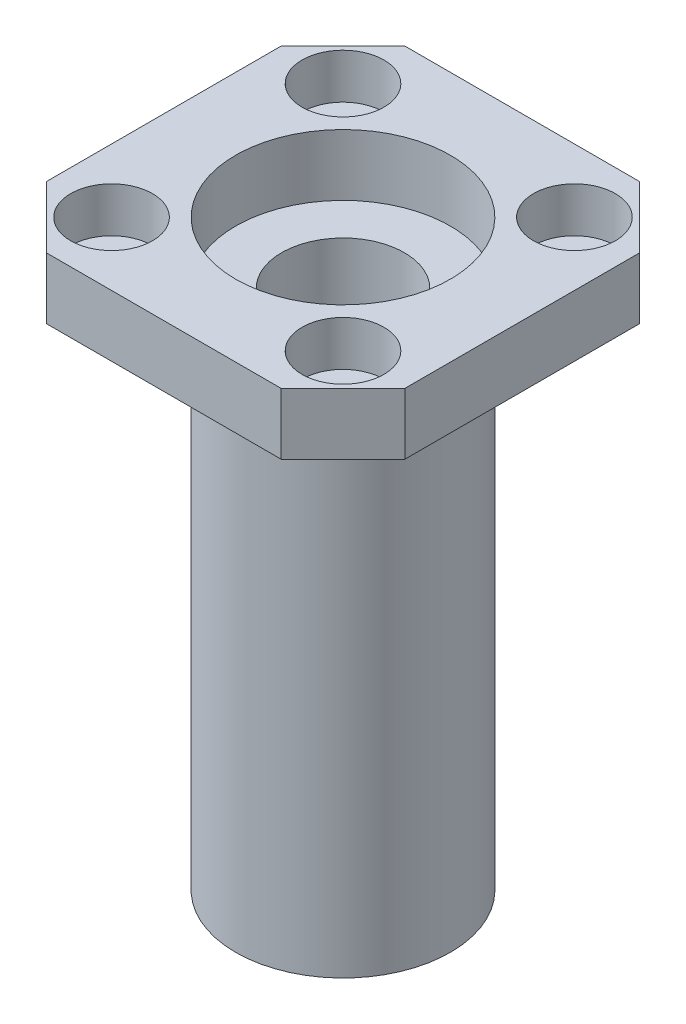
ISO-10303-21;
HEADER;
FILE_DESCRIPTION(('STEP AP214'),'2;1');
FILE_NAME('part.step','',(''),(''),'','','');
FILE_SCHEMA(('AUTOMOTIVE_DESIGN { 1 0 10303 214 1 1 1 1 }'));
ENDSEC;
DATA;
#1=APPLICATION_CONTEXT('core data for automotive mechanical design processes');
#2=APPLICATION_PROTOCOL_DEFINITION('international standard','automotive_design',2000,#1);
#3=PRODUCT_CONTEXT('',#1,'mechanical');
#4=PRODUCT('Part','Part','',(#3));
#5=PRODUCT_RELATED_PRODUCT_CATEGORY('part','',(#4));
#6=PRODUCT_DEFINITION_FORMATION('','',#4);
#7=PRODUCT_DEFINITION_CONTEXT('part definition',#1,'design');
#8=PRODUCT_DEFINITION('design','',#6,#7);
#9=PRODUCT_DEFINITION_SHAPE('','',#8);
#10=(LENGTH_UNIT() NAMED_UNIT(*) SI_UNIT(.MILLI.,.METRE.));
#11=(NAMED_UNIT(*) PLANE_ANGLE_UNIT() SI_UNIT($,.RADIAN.));
#12=(NAMED_UNIT(*) SI_UNIT($,.STERADIAN.) SOLID_ANGLE_UNIT());
#13=UNCERTAINTY_MEASURE_WITH_UNIT(LENGTH_MEASURE(1.E-05),#10,'distance_accuracy_value','');
#14=(GEOMETRIC_REPRESENTATION_CONTEXT(3) GLOBAL_UNCERTAINTY_ASSIGNED_CONTEXT((#13)) GLOBAL_UNIT_ASSIGNED_CONTEXT((#10,
#11,#12)) REPRESENTATION_CONTEXT('',''));
#15=CARTESIAN_POINT('',(0.,0.,0.));
#16=DIRECTION('',(0.,0.,1.));
#17=DIRECTION('',(1.,0.,0.));
#18=AXIS2_PLACEMENT_3D('',#15,#16,#17);
#19=CARTESIAN_POINT('',(-11.3137084989848,57.,11.3137084989848));
#20=DIRECTION('',(0.,-1.,0.));
#21=DIRECTION('',(0.,0.,-1.));
#22=AXIS2_PLACEMENT_3D('',#19,#20,#21);
#23=CYLINDRICAL_SURFACE('',#22,2.25);
#24=CARTESIAN_POINT('',(-11.3137084989848,51.,11.3137084989848));
#25=DIRECTION('',(0.,1.,0.));
#26=DIRECTION('',(0.,0.,1.));
#27=AXIS2_PLACEMENT_3D('',#24,#25,#26);
#28=CIRCLE('',#27,2.25);
#29=CARTESIAN_POINT('',(-11.3137084989848,51.,13.5637084989848));
#30=VERTEX_POINT('',#29);
#31=EDGE_CURVE('E154',#30,#30,#28,.T.);
#32=ORIENTED_EDGE('',*,*,#31,.F.);
#33=EDGE_LOOP('',(#32));
#34=FACE_BOUND('',#33,.T.);
#35=CARTESIAN_POINT('',(-11.3137084989848,52.6,11.3137084989848));
#36=DIRECTION('',(0.,1.,0.));
#37=DIRECTION('',(0.,0.,1.));
#38=AXIS2_PLACEMENT_3D('',#35,#36,#37);
#39=CIRCLE('',#38,2.25);
#40=CARTESIAN_POINT('',(-11.3137084989848,52.6,13.5637084989848));
#41=VERTEX_POINT('',#40);
#42=EDGE_CURVE('E46',#41,#41,#39,.T.);
#43=ORIENTED_EDGE('',*,*,#42,.T.);
#44=EDGE_LOOP('',(#43));
#45=FACE_BOUND('',#44,.T.);
#46=ADVANCED_FACE('F42',(#34,#45),#23,.F.);
#47=CARTESIAN_POINT('',(11.3137084989848,57.,11.3137084989848));
#48=DIRECTION('',(0.,-1.,0.));
#49=DIRECTION('',(0.,0.,-1.));
#50=AXIS2_PLACEMENT_3D('',#47,#48,#49);
#51=CYLINDRICAL_SURFACE('',#50,2.25);
#52=CARTESIAN_POINT('',(11.3137084989848,51.,11.3137084989848));
#53=DIRECTION('',(0.,1.,0.));
#54=DIRECTION('',(0.,0.,1.));
#55=AXIS2_PLACEMENT_3D('',#52,#53,#54);
#56=CIRCLE('',#55,2.25);
#57=CARTESIAN_POINT('',(11.3137084989848,51.,13.5637084989848));
#58=VERTEX_POINT('',#57);
#59=EDGE_CURVE('E150',#58,#58,#56,.T.);
#60=ORIENTED_EDGE('',*,*,#59,.F.);
#61=EDGE_LOOP('',(#60));
#62=FACE_BOUND('',#61,.T.);
#63=CARTESIAN_POINT('',(11.3137084989848,52.6,11.3137084989848));
#64=DIRECTION('',(0.,1.,0.));
#65=DIRECTION('',(0.,0.,1.));
#66=AXIS2_PLACEMENT_3D('',#63,#64,#65);
#67=CIRCLE('',#66,2.25);
#68=CARTESIAN_POINT('',(11.3137084989848,52.6,13.5637084989848));
#69=VERTEX_POINT('',#68);
#70=EDGE_CURVE('E195',#69,#69,#67,.T.);
#71=ORIENTED_EDGE('',*,*,#70,.T.);
#72=EDGE_LOOP('',(#71));
#73=FACE_BOUND('',#72,.T.);
#74=ADVANCED_FACE('F245',(#62,#73),#51,.F.);
#75=CARTESIAN_POINT('',(11.3137084989848,57.,-11.3137084989848));
#76=DIRECTION('',(0.,-1.,0.));
#77=DIRECTION('',(0.,0.,-1.));
#78=AXIS2_PLACEMENT_3D('',#75,#76,#77);
#79=CYLINDRICAL_SURFACE('',#78,2.25);
#80=CARTESIAN_POINT('',(11.3137084989848,51.,-11.3137084989848));
#81=DIRECTION('',(0.,1.,0.));
#82=DIRECTION('',(0.,0.,1.));
#83=AXIS2_PLACEMENT_3D('',#80,#81,#82);
#84=CIRCLE('',#83,2.25);
#85=CARTESIAN_POINT('',(11.3137084989848,51.,-9.06370849898476));
#86=VERTEX_POINT('',#85);
#87=EDGE_CURVE('E147',#86,#86,#84,.T.);
#88=ORIENTED_EDGE('',*,*,#87,.F.);
#89=EDGE_LOOP('',(#88));
#90=FACE_BOUND('',#89,.T.);
#91=CARTESIAN_POINT('',(11.3137084989848,52.6,-11.3137084989848));
#92=DIRECTION('',(0.,1.,0.));
#93=DIRECTION('',(0.,0.,1.));
#94=AXIS2_PLACEMENT_3D('',#91,#92,#93);
#95=CIRCLE('',#94,2.25);
#96=CARTESIAN_POINT('',(11.3137084989848,52.6,-9.06370849898476));
#97=VERTEX_POINT('',#96);
#98=EDGE_CURVE('E193',#97,#97,#95,.T.);
#99=ORIENTED_EDGE('',*,*,#98,.T.);
#100=EDGE_LOOP('',(#99));
#101=FACE_BOUND('',#100,.T.);
#102=ADVANCED_FACE('F44',(#90,#101),#79,.F.);
#103=CARTESIAN_POINT('',(-11.3137084989848,57.,-11.3137084989848));
#104=DIRECTION('',(0.,-1.,0.));
#105=DIRECTION('',(0.,0.,-1.));
#106=AXIS2_PLACEMENT_3D('',#103,#104,#105);
#107=CYLINDRICAL_SURFACE('',#106,2.25);
#108=CARTESIAN_POINT('',(-11.3137084989848,51.,-11.3137084989848));
#109=DIRECTION('',(0.,1.,0.));
#110=DIRECTION('',(0.,0.,1.));
#111=AXIS2_PLACEMENT_3D('',#108,#109,#110);
#112=CIRCLE('',#111,2.25);
#113=CARTESIAN_POINT('',(-11.3137084989848,51.,-9.06370849898476));
#114=VERTEX_POINT('',#113);
#115=EDGE_CURVE('E157',#114,#114,#112,.T.);
#116=ORIENTED_EDGE('',*,*,#115,.F.);
#117=EDGE_LOOP('',(#116));
#118=FACE_BOUND('',#117,.T.);
#119=CARTESIAN_POINT('',(-11.3137084989848,52.6,-11.3137084989848));
#120=DIRECTION('',(0.,1.,0.));
#121=DIRECTION('',(0.,0.,1.));
#122=AXIS2_PLACEMENT_3D('',#119,#120,#121);
#123=CIRCLE('',#122,2.25);
#124=CARTESIAN_POINT('',(-11.3137084989848,52.6,-9.06370849898476));
#125=VERTEX_POINT('',#124);
#126=EDGE_CURVE('E151',#125,#125,#123,.T.);
#127=ORIENTED_EDGE('',*,*,#126,.T.);
#128=EDGE_LOOP('',(#127));
#129=FACE_BOUND('',#128,.T.);
#130=ADVANCED_FACE('F254',(#118,#129),#107,.F.);
#131=CARTESIAN_POINT('',(0.,57.,17.5165451856643));
#132=DIRECTION('',(0.,0.,-1.));
#133=DIRECTION('',(-1.,0.,0.));
#134=AXIS2_PLACEMENT_3D('',#131,#132,#133);
#135=PLANE('',#134);
#136=DIRECTION('',(1.,0.,0.));
#137=VECTOR('',#136,1.);
#138=CARTESIAN_POINT('',(0.,51.,17.5165451856643));
#139=LINE('',#138,#137);
#140=CARTESIAN_POINT('',(-11.4748328429842,51.,17.5165451856643));
#141=VERTEX_POINT('',#140);
#142=CARTESIAN_POINT('',(11.4748328429842,51.,17.5165451856643));
#143=VERTEX_POINT('',#142);
#144=EDGE_CURVE('E160',#141,#143,#139,.T.);
#145=ORIENTED_EDGE('',*,*,#144,.T.);
#146=DIRECTION('',(0.,-1.,0.));
#147=VECTOR('',#146,1.);
#148=CARTESIAN_POINT('',(11.4748328429842,57.,17.5165451856643));
#149=LINE('',#148,#147);
#150=CARTESIAN_POINT('',(11.4748328429842,57.,17.5165451856643));
#151=VERTEX_POINT('',#150);
#152=EDGE_CURVE('E12',#151,#143,#149,.T.);
#153=ORIENTED_EDGE('',*,*,#152,.F.);
#154=DIRECTION('',(1.,0.,0.));
#155=VECTOR('',#154,1.);
#156=CARTESIAN_POINT('',(0.,57.,17.5165451856643));
#157=LINE('',#156,#155);
#158=CARTESIAN_POINT('',(-11.4748328429842,57.,17.5165451856643));
#159=VERTEX_POINT('',#158);
#160=EDGE_CURVE('E181',#159,#151,#157,.T.);
#161=ORIENTED_EDGE('',*,*,#160,.F.);
#162=DIRECTION('',(0.,-1.,0.));
#163=VECTOR('',#162,1.);
#164=CARTESIAN_POINT('',(-11.4748328429842,57.,17.5165451856643));
#165=LINE('',#164,#163);
#166=EDGE_CURVE('E146',#159,#141,#165,.T.);
#167=ORIENTED_EDGE('',*,*,#166,.T.);
#168=EDGE_LOOP('',(#145,#153,#161,#167));
#169=FACE_BOUND('',#168,.T.);
#170=ADVANCED_FACE('F231',(#169),#135,.F.);
#171=CARTESIAN_POINT('',(14.4956890143242,57.,14.4956890143242));
#172=DIRECTION('',(-0.707106781186547,0.,-0.707106781186547));
#173=DIRECTION('',(-0.707106781186548,0.,0.707106781186548));
#174=AXIS2_PLACEMENT_3D('',#171,#172,#173);
#175=PLANE('',#174);
#176=DIRECTION('',(0.707106781186548,0.,-0.707106781186548));
#177=VECTOR('',#176,1.);
#178=CARTESIAN_POINT('',(14.4956890143242,51.,14.4956890143242));
#179=LINE('',#178,#177);
#180=CARTESIAN_POINT('',(17.5165451856643,51.,11.4748328429842));
#181=VERTEX_POINT('',#180);
#182=EDGE_CURVE('E163',#143,#181,#179,.T.);
#183=ORIENTED_EDGE('',*,*,#182,.T.);
#184=DIRECTION('',(0.,-1.,0.));
#185=VECTOR('',#184,1.);
#186=CARTESIAN_POINT('',(17.5165451856643,57.,11.4748328429842));
#187=LINE('',#186,#185);
#188=CARTESIAN_POINT('',(17.5165451856643,57.,11.4748328429842));
#189=VERTEX_POINT('',#188);
#190=EDGE_CURVE('E52',#189,#181,#187,.T.);
#191=ORIENTED_EDGE('',*,*,#190,.F.);
#192=DIRECTION('',(0.707106781186548,0.,-0.707106781186548));
#193=VECTOR('',#192,1.);
#194=CARTESIAN_POINT('',(14.4956890143242,57.,14.4956890143242));
#195=LINE('',#194,#193);
#196=EDGE_CURVE('E103',#151,#189,#195,.T.);
#197=ORIENTED_EDGE('',*,*,#196,.F.);
#198=ORIENTED_EDGE('',*,*,#152,.T.);
#199=EDGE_LOOP('',(#183,#191,#197,#198));
#200=FACE_BOUND('',#199,.T.);
#201=ADVANCED_FACE('F260',(#200),#175,.F.);
#202=CARTESIAN_POINT('',(17.5165451856643,57.,0.));
#203=DIRECTION('',(1.,0.,0.));
#204=DIRECTION('',(0.,0.,-1.));
#205=AXIS2_PLACEMENT_3D('',#202,#203,#204);
#206=PLANE('',#205);
#207=DIRECTION('',(0.,0.,1.));
#208=VECTOR('',#207,1.);
#209=CARTESIAN_POINT('',(17.5165451856643,51.,0.));
#210=LINE('',#209,#208);
#211=CARTESIAN_POINT('',(17.5165451856643,51.,-11.4748328429842));
#212=VERTEX_POINT('',#211);
#213=EDGE_CURVE('E166',#212,#181,#210,.T.);
#214=ORIENTED_EDGE('',*,*,#213,.F.);
#215=DIRECTION('',(0.,-1.,0.));
#216=VECTOR('',#215,1.);
#217=CARTESIAN_POINT('',(17.5165451856643,57.,-11.4748328429842));
#218=LINE('',#217,#216);
#219=CARTESIAN_POINT('',(17.5165451856643,57.,-11.4748328429842));
#220=VERTEX_POINT('',#219);
#221=EDGE_CURVE('E187',#220,#212,#218,.T.);
#222=ORIENTED_EDGE('',*,*,#221,.F.);
#223=DIRECTION('',(0.,0.,1.));
#224=VECTOR('',#223,1.);
#225=CARTESIAN_POINT('',(17.5165451856643,57.,0.));
#226=LINE('',#225,#224);
#227=EDGE_CURVE('E214',#220,#189,#226,.T.);
#228=ORIENTED_EDGE('',*,*,#227,.T.);
#229=ORIENTED_EDGE('',*,*,#190,.T.);
#230=EDGE_LOOP('',(#214,#222,#228,#229));
#231=FACE_BOUND('',#230,.T.);
#232=ADVANCED_FACE('F263',(#231),#206,.T.);
#233=CARTESIAN_POINT('',(14.4956890143242,57.,-14.4956890143242));
#234=DIRECTION('',(0.707106781186548,0.,-0.707106781186547));
#235=DIRECTION('',(-0.707106781186547,0.,-0.707106781186548));
#236=AXIS2_PLACEMENT_3D('',#233,#234,#235);
#237=PLANE('',#236);
#238=DIRECTION('',(0.707106781186547,0.,0.707106781186548));
#239=VECTOR('',#238,1.);
#240=CARTESIAN_POINT('',(14.4956890143242,51.,-14.4956890143242));
#241=LINE('',#240,#239);
#242=CARTESIAN_POINT('',(11.4748328429842,51.,-17.5165451856643));
#243=VERTEX_POINT('',#242);
#244=EDGE_CURVE('E169',#243,#212,#241,.T.);
#245=ORIENTED_EDGE('',*,*,#244,.F.);
#246=DIRECTION('',(0.,-1.,0.));
#247=VECTOR('',#246,1.);
#248=CARTESIAN_POINT('',(11.4748328429842,57.,-17.5165451856643));
#249=LINE('',#248,#247);
#250=CARTESIAN_POINT('',(11.4748328429842,57.,-17.5165451856643));
#251=VERTEX_POINT('',#250);
#252=EDGE_CURVE('E185',#251,#243,#249,.T.);
#253=ORIENTED_EDGE('',*,*,#252,.F.);
#254=DIRECTION('',(0.707106781186547,0.,0.707106781186548));
#255=VECTOR('',#254,1.);
#256=CARTESIAN_POINT('',(14.4956890143242,57.,-14.4956890143242));
#257=LINE('',#256,#255);
#258=EDGE_CURVE('E138',#251,#220,#257,.T.);
#259=ORIENTED_EDGE('',*,*,#258,.T.);
#260=ORIENTED_EDGE('',*,*,#221,.T.);
#261=EDGE_LOOP('',(#245,#253,#259,#260));
#262=FACE_BOUND('',#261,.T.);
#263=ADVANCED_FACE('F219',(#262),#237,.T.);
#264=CARTESIAN_POINT('',(0.,57.,-17.5165451856643));
#265=DIRECTION('',(0.,0.,-1.));
#266=DIRECTION('',(-1.,0.,0.));
#267=AXIS2_PLACEMENT_3D('',#264,#265,#266);
#268=PLANE('',#267);
#269=DIRECTION('',(1.,0.,0.));
#270=VECTOR('',#269,1.);
#271=CARTESIAN_POINT('',(0.,51.,-17.5165451856643));
#272=LINE('',#271,#270);
#273=CARTESIAN_POINT('',(-11.4748328429842,51.,-17.5165451856643));
#274=VERTEX_POINT('',#273);
#275=EDGE_CURVE('E172',#274,#243,#272,.T.);
#276=ORIENTED_EDGE('',*,*,#275,.F.);
#277=DIRECTION('',(0.,-1.,0.));
#278=VECTOR('',#277,1.);
#279=CARTESIAN_POINT('',(-11.4748328429842,57.,-17.5165451856643));
#280=LINE('',#279,#278);
#281=CARTESIAN_POINT('',(-11.4748328429842,57.,-17.5165451856643));
#282=VERTEX_POINT('',#281);
#283=EDGE_CURVE('E125',#282,#274,#280,.T.);
#284=ORIENTED_EDGE('',*,*,#283,.F.);
#285=DIRECTION('',(1.,0.,0.));
#286=VECTOR('',#285,1.);
#287=CARTESIAN_POINT('',(0.,57.,-17.5165451856643));
#288=LINE('',#287,#286);
#289=EDGE_CURVE('E136',#282,#251,#288,.T.);
#290=ORIENTED_EDGE('',*,*,#289,.T.);
#291=ORIENTED_EDGE('',*,*,#252,.T.);
#292=EDGE_LOOP('',(#276,#284,#290,#291));
#293=FACE_BOUND('',#292,.T.);
#294=ADVANCED_FACE('F224',(#293),#268,.T.);
#295=CARTESIAN_POINT('',(-14.4956890143242,57.,-14.4956890143242));
#296=DIRECTION('',(-0.707106781186547,0.,-0.707106781186547));
#297=DIRECTION('',(-0.707106781186548,0.,0.707106781186548));
#298=AXIS2_PLACEMENT_3D('',#295,#296,#297);
#299=PLANE('',#298);
#300=DIRECTION('',(0.707106781186548,0.,-0.707106781186548));
#301=VECTOR('',#300,1.);
#302=CARTESIAN_POINT('',(-14.4956890143242,51.,-14.4956890143242));
#303=LINE('',#302,#301);
#304=CARTESIAN_POINT('',(-17.5165451856643,51.,-11.4748328429842));
#305=VERTEX_POINT('',#304);
#306=EDGE_CURVE('E124',#305,#274,#303,.T.);
#307=ORIENTED_EDGE('',*,*,#306,.F.);
#308=DIRECTION('',(0.,-1.,0.));
#309=VECTOR('',#308,1.);
#310=CARTESIAN_POINT('',(-17.5165451856643,57.,-11.4748328429842));
#311=LINE('',#310,#309);
#312=CARTESIAN_POINT('',(-17.5165451856643,57.,-11.4748328429842));
#313=VERTEX_POINT('',#312);
#314=EDGE_CURVE('E118',#313,#305,#311,.T.);
#315=ORIENTED_EDGE('',*,*,#314,.F.);
#316=DIRECTION('',(0.707106781186548,0.,-0.707106781186548));
#317=VECTOR('',#316,1.);
#318=CARTESIAN_POINT('',(-14.4956890143242,57.,-14.4956890143242));
#319=LINE('',#318,#317);
#320=EDGE_CURVE('E122',#313,#282,#319,.T.);
#321=ORIENTED_EDGE('',*,*,#320,.T.);
#322=ORIENTED_EDGE('',*,*,#283,.T.);
#323=EDGE_LOOP('',(#307,#315,#321,#322));
#324=FACE_BOUND('',#323,.T.);
#325=ADVANCED_FACE('F120',(#324),#299,.T.);
#326=CARTESIAN_POINT('',(-17.5165451856643,57.,0.));
#327=DIRECTION('',(1.,0.,0.));
#328=DIRECTION('',(0.,0.,-1.));
#329=AXIS2_PLACEMENT_3D('',#326,#327,#328);
#330=PLANE('',#329);
#331=DIRECTION('',(0.,0.,1.));
#332=VECTOR('',#331,1.);
#333=CARTESIAN_POINT('',(-17.5165451856643,51.,0.));
#334=LINE('',#333,#332);
#335=CARTESIAN_POINT('',(-17.5165451856643,51.,11.4748328429842));
#336=VERTEX_POINT('',#335);
#337=EDGE_CURVE('E89',#305,#336,#334,.T.);
#338=ORIENTED_EDGE('',*,*,#337,.T.);
#339=DIRECTION('',(0.,-1.,0.));
#340=VECTOR('',#339,1.);
#341=CARTESIAN_POINT('',(-17.5165451856643,57.,11.4748328429842));
#342=LINE('',#341,#340);
#343=CARTESIAN_POINT('',(-17.5165451856643,57.,11.4748328429842));
#344=VERTEX_POINT('',#343);
#345=EDGE_CURVE('E126',#344,#336,#342,.T.);
#346=ORIENTED_EDGE('',*,*,#345,.F.);
#347=DIRECTION('',(0.,0.,1.));
#348=VECTOR('',#347,1.);
#349=CARTESIAN_POINT('',(-17.5165451856643,57.,0.));
#350=LINE('',#349,#348);
#351=EDGE_CURVE('E128',#313,#344,#350,.T.);
#352=ORIENTED_EDGE('',*,*,#351,.F.);
#353=ORIENTED_EDGE('',*,*,#314,.T.);
#354=EDGE_LOOP('',(#338,#346,#352,#353));
#355=FACE_BOUND('',#354,.T.);
#356=ADVANCED_FACE('F129',(#355),#330,.F.);
#357=CARTESIAN_POINT('',(-14.4956890143242,57.,14.4956890143242));
#358=DIRECTION('',(0.707106781186547,0.,-0.707106781186547));
#359=DIRECTION('',(-0.707106781186548,0.,-0.707106781186548));
#360=AXIS2_PLACEMENT_3D('',#357,#358,#359);
#361=PLANE('',#360);
#362=DIRECTION('',(0.707106781186548,0.,0.707106781186548));
#363=VECTOR('',#362,1.);
#364=CARTESIAN_POINT('',(-14.4956890143242,51.,14.4956890143242));
#365=LINE('',#364,#363);
#366=EDGE_CURVE('E95',#336,#141,#365,.T.);
#367=ORIENTED_EDGE('',*,*,#366,.T.);
#368=ORIENTED_EDGE('',*,*,#166,.F.);
#369=DIRECTION('',(0.707106781186548,0.,0.707106781186548));
#370=VECTOR('',#369,1.);
#371=CARTESIAN_POINT('',(-14.4956890143242,57.,14.4956890143242));
#372=LINE('',#371,#370);
#373=EDGE_CURVE('E61',#344,#159,#372,.T.);
#374=ORIENTED_EDGE('',*,*,#373,.F.);
#375=ORIENTED_EDGE('',*,*,#345,.T.);
#376=EDGE_LOOP('',(#367,#368,#374,#375));
#377=FACE_BOUND('',#376,.T.);
#378=ADVANCED_FACE('F233',(#377),#361,.F.);
#379=CARTESIAN_POINT('',(0.,57.,0.));
#380=DIRECTION('',(0.,-1.,0.));
#381=DIRECTION('',(0.,0.,-1.));
#382=AXIS2_PLACEMENT_3D('',#379,#380,#381);
#383=CYLINDRICAL_SURFACE('',#382,10.5);
#384=CARTESIAN_POINT('',(0.,57.,0.));
#385=DIRECTION('',(0.,1.,0.));
#386=DIRECTION('',(0.,0.,1.));
#387=AXIS2_PLACEMENT_3D('',#384,#385,#386);
#388=CIRCLE('',#387,10.5);
#389=CARTESIAN_POINT('',(0.,57.,10.5));
#390=VERTEX_POINT('',#389);
#391=EDGE_CURVE('E143',#390,#390,#388,.T.);
#392=ORIENTED_EDGE('',*,*,#391,.T.);
#393=EDGE_LOOP('',(#392));
#394=FACE_BOUND('',#393,.T.);
#395=CARTESIAN_POINT('',(0.,51.,0.));
#396=DIRECTION('',(0.,1.,0.));
#397=DIRECTION('',(0.,0.,1.));
#398=AXIS2_PLACEMENT_3D('',#395,#396,#397);
#399=CIRCLE('',#398,10.5);
#400=CARTESIAN_POINT('',(0.,51.,10.5));
#401=VERTEX_POINT('',#400);
#402=EDGE_CURVE('E178',#401,#401,#399,.T.);
#403=ORIENTED_EDGE('',*,*,#402,.F.);
#404=EDGE_LOOP('',(#403));
#405=FACE_BOUND('',#404,.T.);
#406=ADVANCED_FACE('F235',(#394,#405),#383,.F.);
#407=CARTESIAN_POINT('',(0.,57.,0.));
#408=DIRECTION('',(0.,1.,0.));
#409=DIRECTION('',(0.,0.,1.));
#410=AXIS2_PLACEMENT_3D('',#407,#408,#409);
#411=PLANE('',#410);
#412=CARTESIAN_POINT('',(-11.3137084989848,57.,11.3137084989848));
#413=DIRECTION('',(0.,1.,0.));
#414=DIRECTION('',(0.,0.,1.));
#415=AXIS2_PLACEMENT_3D('',#412,#413,#414);
#416=CIRCLE('',#415,4.);
#417=CARTESIAN_POINT('',(-11.3137084989848,57.,15.3137084989848));
#418=VERTEX_POINT('',#417);
#419=EDGE_CURVE('E421',#418,#418,#416,.T.);
#420=ORIENTED_EDGE('',*,*,#419,.F.);
#421=EDGE_LOOP('',(#420));
#422=FACE_BOUND('',#421,.T.);
#423=CARTESIAN_POINT('',(11.3137084989848,57.,11.3137084989848));
#424=DIRECTION('',(0.,1.,0.));
#425=DIRECTION('',(0.,0.,1.));
#426=AXIS2_PLACEMENT_3D('',#423,#424,#425);
#427=CIRCLE('',#426,4.);
#428=CARTESIAN_POINT('',(11.3137084989848,57.,15.3137084989848));
#429=VERTEX_POINT('',#428);
#430=EDGE_CURVE('E429',#429,#429,#427,.T.);
#431=ORIENTED_EDGE('',*,*,#430,.F.);
#432=EDGE_LOOP('',(#431));
#433=FACE_BOUND('',#432,.T.);
#434=CARTESIAN_POINT('',(11.3137084989848,57.,-11.3137084989848));
#435=DIRECTION('',(0.,1.,0.));
#436=DIRECTION('',(0.,0.,1.));
#437=AXIS2_PLACEMENT_3D('',#434,#435,#436);
#438=CIRCLE('',#437,4.);
#439=CARTESIAN_POINT('',(11.3137084989848,57.,-7.31370849898476));
#440=VERTEX_POINT('',#439);
#441=EDGE_CURVE('E434',#440,#440,#438,.T.);
#442=ORIENTED_EDGE('',*,*,#441,.F.);
#443=EDGE_LOOP('',(#442));
#444=FACE_BOUND('',#443,.T.);
#445=CARTESIAN_POINT('',(-11.3137084989848,57.,-11.3137084989848));
#446=DIRECTION('',(0.,1.,0.));
#447=DIRECTION('',(0.,0.,1.));
#448=AXIS2_PLACEMENT_3D('',#445,#446,#447);
#449=CIRCLE('',#448,4.);
#450=CARTESIAN_POINT('',(-11.3137084989848,57.,-7.31370849898476));
#451=VERTEX_POINT('',#450);
#452=EDGE_CURVE('E201',#451,#451,#449,.T.);
#453=ORIENTED_EDGE('',*,*,#452,.F.);
#454=EDGE_LOOP('',(#453));
#455=FACE_BOUND('',#454,.T.);
#456=ORIENTED_EDGE('',*,*,#160,.T.);
#457=ORIENTED_EDGE('',*,*,#196,.T.);
#458=ORIENTED_EDGE('',*,*,#227,.F.);
#459=ORIENTED_EDGE('',*,*,#258,.F.);
#460=ORIENTED_EDGE('',*,*,#289,.F.);
#461=ORIENTED_EDGE('',*,*,#320,.F.);
#462=ORIENTED_EDGE('',*,*,#351,.T.);
#463=ORIENTED_EDGE('',*,*,#373,.T.);
#464=EDGE_LOOP('',(#456,#457,#458,#459,#460,#461,#462,#463));
#465=FACE_BOUND('',#464,.T.);
#466=ORIENTED_EDGE('',*,*,#391,.F.);
#467=EDGE_LOOP('',(#466));
#468=FACE_BOUND('',#467,.T.);
#469=ADVANCED_FACE('F132',(#422,#433,#444,#455,#465,#468),#411,.T.);
#470=CARTESIAN_POINT('',(0.,51.,0.));
#471=DIRECTION('',(0.,1.,0.));
#472=DIRECTION('',(0.,0.,1.));
#473=AXIS2_PLACEMENT_3D('',#470,#471,#472);
#474=PLANE('',#473);
#475=ORIENTED_EDGE('',*,*,#87,.T.);
#476=EDGE_LOOP('',(#475));
#477=FACE_BOUND('',#476,.T.);
#478=ORIENTED_EDGE('',*,*,#59,.T.);
#479=EDGE_LOOP('',(#478));
#480=FACE_BOUND('',#479,.T.);
#481=ORIENTED_EDGE('',*,*,#31,.T.);
#482=EDGE_LOOP('',(#481));
#483=FACE_BOUND('',#482,.T.);
#484=ORIENTED_EDGE('',*,*,#115,.T.);
#485=EDGE_LOOP('',(#484));
#486=FACE_BOUND('',#485,.T.);
#487=ORIENTED_EDGE('',*,*,#144,.F.);
#488=ORIENTED_EDGE('',*,*,#366,.F.);
#489=ORIENTED_EDGE('',*,*,#337,.F.);
#490=ORIENTED_EDGE('',*,*,#306,.T.);
#491=ORIENTED_EDGE('',*,*,#275,.T.);
#492=ORIENTED_EDGE('',*,*,#244,.T.);
#493=ORIENTED_EDGE('',*,*,#213,.T.);
#494=ORIENTED_EDGE('',*,*,#182,.F.);
#495=EDGE_LOOP('',(#487,#488,#489,#490,#491,#492,#493,#494));
#496=FACE_BOUND('',#495,.T.);
#497=ORIENTED_EDGE('',*,*,#402,.T.);
#498=EDGE_LOOP('',(#497));
#499=FACE_BOUND('',#498,.T.);
#500=ADVANCED_FACE('F227',(#477,#480,#483,#486,#496,#499),#474,.F.);
#501=CARTESIAN_POINT('',(-11.3137084989848,52.6,-11.3137084989848));
#502=DIRECTION('',(0.,1.,0.));
#503=DIRECTION('',(0.,0.,1.));
#504=AXIS2_PLACEMENT_3D('',#501,#502,#503);
#505=CYLINDRICAL_SURFACE('',#504,4.);
#506=CARTESIAN_POINT('',(-11.3137084989848,52.6,-11.3137084989848));
#507=DIRECTION('',(0.,1.,0.));
#508=DIRECTION('',(0.,0.,1.));
#509=AXIS2_PLACEMENT_3D('',#506,#507,#508);
#510=CIRCLE('',#509,4.);
#511=CARTESIAN_POINT('',(-11.3137084989848,52.6,-7.31370849898476));
#512=VERTEX_POINT('',#511);
#513=EDGE_CURVE('E192',#512,#512,#510,.T.);
#514=ORIENTED_EDGE('',*,*,#513,.F.);
#515=EDGE_LOOP('',(#514));
#516=FACE_BOUND('',#515,.T.);
#517=ORIENTED_EDGE('',*,*,#452,.T.);
#518=EDGE_LOOP('',(#517));
#519=FACE_BOUND('',#518,.T.);
#520=ADVANCED_FACE('F300',(#516,#519),#505,.F.);
#521=CARTESIAN_POINT('',(-11.3137084989848,52.6,-11.3137084989848));
#522=DIRECTION('',(0.,1.,0.));
#523=DIRECTION('',(0.,0.,1.));
#524=AXIS2_PLACEMENT_3D('',#521,#522,#523);
#525=PLANE('',#524);
#526=ORIENTED_EDGE('',*,*,#126,.F.);
#527=EDGE_LOOP('',(#526));
#528=FACE_BOUND('',#527,.T.);
#529=ORIENTED_EDGE('',*,*,#513,.T.);
#530=EDGE_LOOP('',(#529));
#531=FACE_BOUND('',#530,.T.);
#532=ADVANCED_FACE('F344',(#528,#531),#525,.T.);
#533=CARTESIAN_POINT('',(11.3137084989848,52.6,-11.3137084989848));
#534=DIRECTION('',(0.,1.,0.));
#535=DIRECTION('',(0.,0.,1.));
#536=AXIS2_PLACEMENT_3D('',#533,#534,#535);
#537=CYLINDRICAL_SURFACE('',#536,4.);
#538=CARTESIAN_POINT('',(11.3137084989848,52.6,-11.3137084989848));
#539=DIRECTION('',(0.,1.,0.));
#540=DIRECTION('',(0.,0.,1.));
#541=AXIS2_PLACEMENT_3D('',#538,#539,#540);
#542=CIRCLE('',#541,4.);
#543=CARTESIAN_POINT('',(11.3137084989848,52.6,-7.31370849898476));
#544=VERTEX_POINT('',#543);
#545=EDGE_CURVE('E432',#544,#544,#542,.T.);
#546=ORIENTED_EDGE('',*,*,#545,.F.);
#547=EDGE_LOOP('',(#546));
#548=FACE_BOUND('',#547,.T.);
#549=ORIENTED_EDGE('',*,*,#441,.T.);
#550=EDGE_LOOP('',(#549));
#551=FACE_BOUND('',#550,.T.);
#552=ADVANCED_FACE('F354',(#548,#551),#537,.F.);
#553=CARTESIAN_POINT('',(11.3137084989848,52.6,-11.3137084989848));
#554=DIRECTION('',(0.,1.,0.));
#555=DIRECTION('',(0.,0.,1.));
#556=AXIS2_PLACEMENT_3D('',#553,#554,#555);
#557=PLANE('',#556);
#558=ORIENTED_EDGE('',*,*,#98,.F.);
#559=EDGE_LOOP('',(#558));
#560=FACE_BOUND('',#559,.T.);
#561=ORIENTED_EDGE('',*,*,#545,.T.);
#562=EDGE_LOOP('',(#561));
#563=FACE_BOUND('',#562,.T.);
#564=ADVANCED_FACE('F364',(#560,#563),#557,.T.);
#565=CARTESIAN_POINT('',(11.3137084989848,52.6,11.3137084989848));
#566=DIRECTION('',(0.,1.,0.));
#567=DIRECTION('',(0.,0.,1.));
#568=AXIS2_PLACEMENT_3D('',#565,#566,#567);
#569=CYLINDRICAL_SURFACE('',#568,4.);
#570=CARTESIAN_POINT('',(11.3137084989848,52.6,11.3137084989848));
#571=DIRECTION('',(0.,1.,0.));
#572=DIRECTION('',(0.,0.,1.));
#573=AXIS2_PLACEMENT_3D('',#570,#571,#572);
#574=CIRCLE('',#573,4.);
#575=CARTESIAN_POINT('',(11.3137084989848,52.6,15.3137084989848));
#576=VERTEX_POINT('',#575);
#577=EDGE_CURVE('E424',#576,#576,#574,.T.);
#578=ORIENTED_EDGE('',*,*,#577,.F.);
#579=EDGE_LOOP('',(#578));
#580=FACE_BOUND('',#579,.T.);
#581=ORIENTED_EDGE('',*,*,#430,.T.);
#582=EDGE_LOOP('',(#581));
#583=FACE_BOUND('',#582,.T.);
#584=ADVANCED_FACE('F374',(#580,#583),#569,.F.);
#585=CARTESIAN_POINT('',(11.3137084989848,52.6,11.3137084989848));
#586=DIRECTION('',(0.,1.,0.));
#587=DIRECTION('',(0.,0.,1.));
#588=AXIS2_PLACEMENT_3D('',#585,#586,#587);
#589=PLANE('',#588);
#590=ORIENTED_EDGE('',*,*,#70,.F.);
#591=EDGE_LOOP('',(#590));
#592=FACE_BOUND('',#591,.T.);
#593=ORIENTED_EDGE('',*,*,#577,.T.);
#594=EDGE_LOOP('',(#593));
#595=FACE_BOUND('',#594,.T.);
#596=ADVANCED_FACE('F384',(#592,#595),#589,.T.);
#597=CARTESIAN_POINT('',(-11.3137084989848,52.6,11.3137084989848));
#598=DIRECTION('',(0.,1.,0.));
#599=DIRECTION('',(0.,0.,1.));
#600=AXIS2_PLACEMENT_3D('',#597,#598,#599);
#601=CYLINDRICAL_SURFACE('',#600,4.);
#602=CARTESIAN_POINT('',(-11.3137084989848,52.6,11.3137084989848));
#603=DIRECTION('',(0.,1.,0.));
#604=DIRECTION('',(0.,0.,1.));
#605=AXIS2_PLACEMENT_3D('',#602,#603,#604);
#606=CIRCLE('',#605,4.);
#607=CARTESIAN_POINT('',(-11.3137084989848,52.6,15.3137084989848));
#608=VERTEX_POINT('',#607);
#609=EDGE_CURVE('E196',#608,#608,#606,.T.);
#610=ORIENTED_EDGE('',*,*,#609,.F.);
#611=EDGE_LOOP('',(#610));
#612=FACE_BOUND('',#611,.T.);
#613=ORIENTED_EDGE('',*,*,#419,.T.);
#614=EDGE_LOOP('',(#613));
#615=FACE_BOUND('',#614,.T.);
#616=ADVANCED_FACE('F394',(#612,#615),#601,.F.);
#617=CARTESIAN_POINT('',(-11.3137084989848,52.6,11.3137084989848));
#618=DIRECTION('',(0.,1.,0.));
#619=DIRECTION('',(0.,0.,1.));
#620=AXIS2_PLACEMENT_3D('',#617,#618,#619);
#621=PLANE('',#620);
#622=ORIENTED_EDGE('',*,*,#42,.F.);
#623=EDGE_LOOP('',(#622));
#624=FACE_BOUND('',#623,.T.);
#625=ORIENTED_EDGE('',*,*,#609,.T.);
#626=EDGE_LOOP('',(#625));
#627=FACE_BOUND('',#626,.T.);
#628=ADVANCED_FACE('F404',(#624,#627),#621,.T.);
#629=CLOSED_SHELL('',(#46,#74,#102,#130,#170,#201,#232,#263,#294,#325,#356,#378,#406,#469,#500,
#520,#532,#552,#564,#584,#596,#616,#628));
#630=MANIFOLD_SOLID_BREP('B2',#629);
#631=CARTESIAN_POINT('',(0.,51.,0.));
#632=DIRECTION('',(0.,1.,0.));
#633=DIRECTION('',(0.,0.,1.));
#634=AXIS2_PLACEMENT_3D('',#631,#632,#633);
#635=PLANE('',#634);
#636=CARTESIAN_POINT('',(0.,51.,0.));
#637=DIRECTION('',(0.,1.,0.));
#638=DIRECTION('',(0.,0.,1.));
#639=AXIS2_PLACEMENT_3D('',#636,#637,#638);
#640=CIRCLE('',#639,10.5);
#641=CARTESIAN_POINT('',(0.,51.,10.5));
#642=VERTEX_POINT('',#641);
#643=EDGE_CURVE('E41',#642,#642,#640,.T.);
#644=ORIENTED_EDGE('',*,*,#643,.T.);
#645=EDGE_LOOP('',(#644));
#646=FACE_BOUND('',#645,.T.);
#647=CARTESIAN_POINT('',(0.,51.,0.));
#648=DIRECTION('',(0.,1.,0.));
#649=DIRECTION('',(0.,0.,1.));
#650=AXIS2_PLACEMENT_3D('',#647,#648,#649);
#651=CIRCLE('',#650,6.);
#652=CARTESIAN_POINT('',(0.,51.,6.));
#653=VERTEX_POINT('',#652);
#654=EDGE_CURVE('E511',#653,#653,#651,.T.);
#655=ORIENTED_EDGE('',*,*,#654,.F.);
#656=EDGE_LOOP('',(#655));
#657=FACE_BOUND('',#656,.T.);
#658=ADVANCED_FACE('F500',(#646,#657),#635,.T.);
#659=CARTESIAN_POINT('',(0.,0.,0.));
#660=DIRECTION('',(0.,1.,0.));
#661=DIRECTION('',(0.,0.,1.));
#662=AXIS2_PLACEMENT_3D('',#659,#660,#661);
#663=PLANE('',#662);
#664=CARTESIAN_POINT('',(0.,0.,0.));
#665=DIRECTION('',(0.,1.,0.));
#666=DIRECTION('',(0.,0.,1.));
#667=AXIS2_PLACEMENT_3D('',#664,#665,#666);
#668=CIRCLE('',#667,10.5);
#669=CARTESIAN_POINT('',(0.,0.,10.5));
#670=VERTEX_POINT('',#669);
#671=EDGE_CURVE('E504',#670,#670,#668,.T.);
#672=ORIENTED_EDGE('',*,*,#671,.F.);
#673=EDGE_LOOP('',(#672));
#674=FACE_BOUND('',#673,.T.);
#675=CARTESIAN_POINT('',(0.,0.,0.));
#676=DIRECTION('',(0.,1.,0.));
#677=DIRECTION('',(0.,0.,1.));
#678=AXIS2_PLACEMENT_3D('',#675,#676,#677);
#679=CIRCLE('',#678,6.);
#680=CARTESIAN_POINT('',(0.,0.,6.));
#681=VERTEX_POINT('',#680);
#682=EDGE_CURVE('E513',#681,#681,#679,.T.);
#683=ORIENTED_EDGE('',*,*,#682,.T.);
#684=EDGE_LOOP('',(#683));
#685=FACE_BOUND('',#684,.T.);
#686=ADVANCED_FACE('F523',(#674,#685),#663,.F.);
#687=CARTESIAN_POINT('',(0.,51.,0.));
#688=DIRECTION('',(0.,-1.,0.));
#689=DIRECTION('',(0.,0.,-1.));
#690=AXIS2_PLACEMENT_3D('',#687,#688,#689);
#691=CYLINDRICAL_SURFACE('',#690,10.5);
#692=ORIENTED_EDGE('',*,*,#643,.F.);
#693=EDGE_LOOP('',(#692));
#694=FACE_BOUND('',#693,.T.);
#695=ORIENTED_EDGE('',*,*,#671,.T.);
#696=EDGE_LOOP('',(#695));
#697=FACE_BOUND('',#696,.T.);
#698=ADVANCED_FACE('F502',(#694,#697),#691,.T.);
#699=CARTESIAN_POINT('',(0.,51.,0.));
#700=DIRECTION('',(0.,-1.,0.));
#701=DIRECTION('',(0.,0.,-1.));
#702=AXIS2_PLACEMENT_3D('',#699,#700,#701);
#703=CYLINDRICAL_SURFACE('',#702,6.);
#704=ORIENTED_EDGE('',*,*,#654,.T.);
#705=EDGE_LOOP('',(#704));
#706=FACE_BOUND('',#705,.T.);
#707=ORIENTED_EDGE('',*,*,#682,.F.);
#708=EDGE_LOOP('',(#707));
#709=FACE_BOUND('',#708,.T.);
#710=ADVANCED_FACE('F519',(#706,#709),#703,.F.);
#711=CLOSED_SHELL('',(#658,#686,#698,#710));
#712=MANIFOLD_SOLID_BREP('B6',#711);
#713=ADVANCED_BREP_SHAPE_REPRESENTATION('',(#18,#630,#712),#14);
#714=SHAPE_DEFINITION_REPRESENTATION(#9,#713);
ENDSEC;
END-ISO-10303-21;
